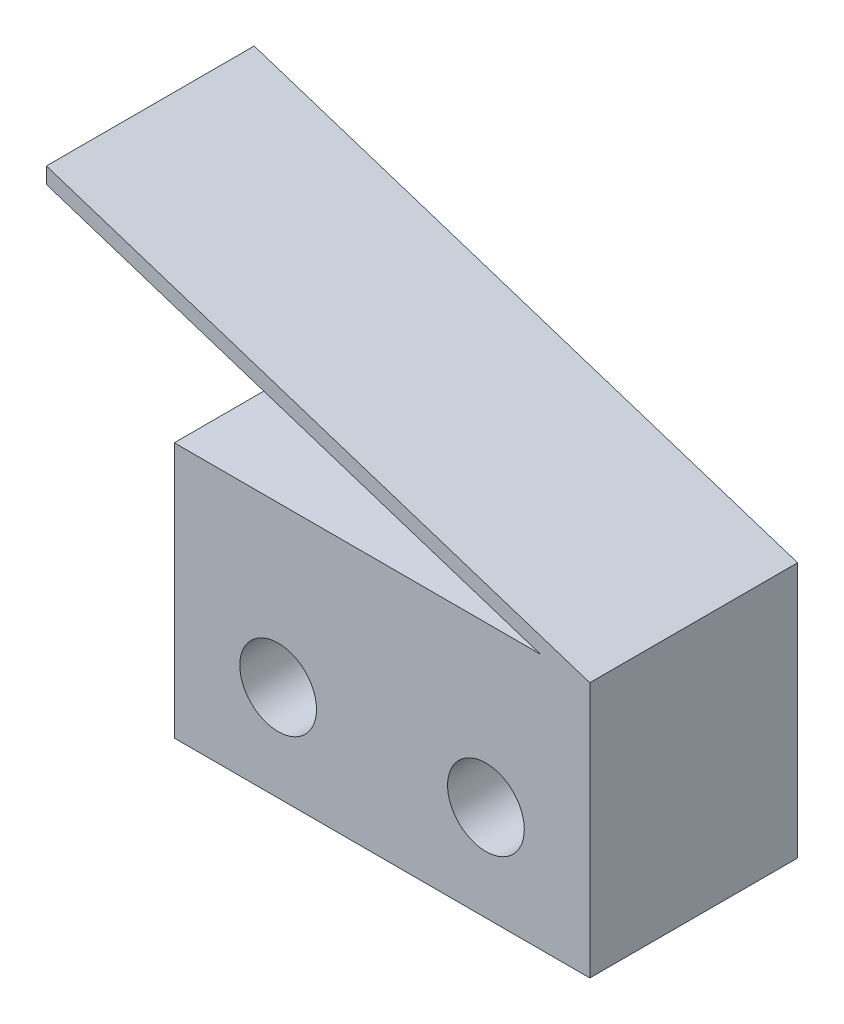
ISO-10303-21;
HEADER;
FILE_DESCRIPTION(('STEP AP214'),'2;1');
FILE_NAME('part.step','',(''),(''),'','','');
FILE_SCHEMA(('AUTOMOTIVE_DESIGN { 1 0 10303 214 1 1 1 1 }'));
ENDSEC;
DATA;
#1=APPLICATION_CONTEXT('core data for automotive mechanical design processes');
#2=APPLICATION_PROTOCOL_DEFINITION('international standard','automotive_design',2000,#1);
#3=PRODUCT_CONTEXT('',#1,'mechanical');
#4=PRODUCT('Part','Part','',(#3));
#5=PRODUCT_RELATED_PRODUCT_CATEGORY('part','',(#4));
#6=PRODUCT_DEFINITION_FORMATION('','',#4);
#7=PRODUCT_DEFINITION_CONTEXT('part definition',#1,'design');
#8=PRODUCT_DEFINITION('design','',#6,#7);
#9=PRODUCT_DEFINITION_SHAPE('','',#8);
#10=(LENGTH_UNIT() NAMED_UNIT(*) SI_UNIT(.MILLI.,.METRE.));
#11=(NAMED_UNIT(*) PLANE_ANGLE_UNIT() SI_UNIT($,.RADIAN.));
#12=(NAMED_UNIT(*) SI_UNIT($,.STERADIAN.) SOLID_ANGLE_UNIT());
#13=UNCERTAINTY_MEASURE_WITH_UNIT(LENGTH_MEASURE(1.E-05),#10,'distance_accuracy_value','');
#14=(GEOMETRIC_REPRESENTATION_CONTEXT(3) GLOBAL_UNCERTAINTY_ASSIGNED_CONTEXT((#13)) GLOBAL_UNIT_ASSIGNED_CONTEXT((#10,
#11,#12)) REPRESENTATION_CONTEXT('',''));
#15=CARTESIAN_POINT('',(0.,0.,0.));
#16=DIRECTION('',(0.,0.,1.));
#17=DIRECTION('',(1.,0.,0.));
#18=AXIS2_PLACEMENT_3D('',#15,#16,#17);
#19=CARTESIAN_POINT('',(0.,8.,6.5));
#20=DIRECTION('',(1.,0.,0.));
#21=DIRECTION('',(0.,1.,0.));
#22=AXIS2_PLACEMENT_3D('',#19,#20,#21);
#23=PLANE('',#22);
#24=DIRECTION('',(0.,-1.,0.));
#25=VECTOR('',#24,1.);
#26=CARTESIAN_POINT('',(0.,8.,0.));
#27=LINE('',#26,#25);
#28=CARTESIAN_POINT('',(0.,8.,0.));
#29=VERTEX_POINT('',#28);
#30=CARTESIAN_POINT('',(0.,0.,0.));
#31=VERTEX_POINT('',#30);
#32=EDGE_CURVE('E129',#29,#31,#27,.T.);
#33=ORIENTED_EDGE('',*,*,#32,.T.);
#34=DIRECTION('',(0.,0.,-1.));
#35=VECTOR('',#34,1.);
#36=CARTESIAN_POINT('',(0.,0.,6.5));
#37=LINE('',#36,#35);
#38=CARTESIAN_POINT('',(0.,0.,6.5));
#39=VERTEX_POINT('',#38);
#40=EDGE_CURVE('E11',#39,#31,#37,.T.);
#41=ORIENTED_EDGE('',*,*,#40,.F.);
#42=DIRECTION('',(0.,-1.,0.));
#43=VECTOR('',#42,1.);
#44=CARTESIAN_POINT('',(0.,8.,6.5));
#45=LINE('',#44,#43);
#46=CARTESIAN_POINT('',(0.,8.,6.5));
#47=VERTEX_POINT('',#46);
#48=EDGE_CURVE('E145',#47,#39,#45,.T.);
#49=ORIENTED_EDGE('',*,*,#48,.F.);
#50=DIRECTION('',(0.,0.,-1.));
#51=VECTOR('',#50,1.);
#52=CARTESIAN_POINT('',(0.,8.,6.5));
#53=LINE('',#52,#51);
#54=EDGE_CURVE('E124',#47,#29,#53,.T.);
#55=ORIENTED_EDGE('',*,*,#54,.T.);
#56=EDGE_LOOP('',(#33,#41,#49,#55));
#57=FACE_BOUND('',#56,.T.);
#58=ADVANCED_FACE('F39',(#57),#23,.F.);
#59=CARTESIAN_POINT('',(0.,0.,6.5));
#60=DIRECTION('',(0.,1.,0.));
#61=DIRECTION('',(0.,0.,1.));
#62=AXIS2_PLACEMENT_3D('',#59,#60,#61);
#63=PLANE('',#62);
#64=DIRECTION('',(1.,0.,0.));
#65=VECTOR('',#64,1.);
#66=CARTESIAN_POINT('',(0.,0.,0.));
#67=LINE('',#66,#65);
#68=CARTESIAN_POINT('',(13.,0.,0.));
#69=VERTEX_POINT('',#68);
#70=EDGE_CURVE('E135',#31,#69,#67,.T.);
#71=ORIENTED_EDGE('',*,*,#70,.T.);
#72=DIRECTION('',(0.,0.,-1.));
#73=VECTOR('',#72,1.);
#74=CARTESIAN_POINT('',(13.,0.,6.5));
#75=LINE('',#74,#73);
#76=CARTESIAN_POINT('',(13.,0.,6.5));
#77=VERTEX_POINT('',#76);
#78=EDGE_CURVE('E50',#77,#69,#75,.T.);
#79=ORIENTED_EDGE('',*,*,#78,.F.);
#80=DIRECTION('',(1.,0.,0.));
#81=VECTOR('',#80,1.);
#82=CARTESIAN_POINT('',(0.,0.,6.5));
#83=LINE('',#82,#81);
#84=EDGE_CURVE('E94',#39,#77,#83,.T.);
#85=ORIENTED_EDGE('',*,*,#84,.F.);
#86=ORIENTED_EDGE('',*,*,#40,.T.);
#87=EDGE_LOOP('',(#71,#79,#85,#86));
#88=FACE_BOUND('',#87,.T.);
#89=ADVANCED_FACE('F202',(#88),#63,.F.);
#90=CARTESIAN_POINT('',(13.,0.,6.5));
#91=DIRECTION('',(-1.,0.,0.));
#92=DIRECTION('',(0.,0.,1.));
#93=AXIS2_PLACEMENT_3D('',#90,#91,#92);
#94=PLANE('',#93);
#95=DIRECTION('',(0.,1.,0.));
#96=VECTOR('',#95,1.);
#97=CARTESIAN_POINT('',(13.,0.,0.));
#98=LINE('',#97,#96);
#99=CARTESIAN_POINT('',(13.,8.,0.));
#100=VERTEX_POINT('',#99);
#101=EDGE_CURVE('E134',#69,#100,#98,.T.);
#102=ORIENTED_EDGE('',*,*,#101,.T.);
#103=DIRECTION('',(0.,0.,-1.));
#104=VECTOR('',#103,1.);
#105=CARTESIAN_POINT('',(13.,8.,6.5));
#106=LINE('',#105,#104);
#107=CARTESIAN_POINT('',(13.,8.,6.5));
#108=VERTEX_POINT('',#107);
#109=EDGE_CURVE('E147',#108,#100,#106,.T.);
#110=ORIENTED_EDGE('',*,*,#109,.F.);
#111=DIRECTION('',(0.,1.,0.));
#112=VECTOR('',#111,1.);
#113=CARTESIAN_POINT('',(13.,0.,6.5));
#114=LINE('',#113,#112);
#115=EDGE_CURVE('E152',#77,#108,#114,.T.);
#116=ORIENTED_EDGE('',*,*,#115,.F.);
#117=ORIENTED_EDGE('',*,*,#78,.T.);
#118=EDGE_LOOP('',(#102,#110,#116,#117));
#119=FACE_BOUND('',#118,.T.);
#120=ADVANCED_FACE('F155',(#119),#94,.F.);
#121=CARTESIAN_POINT('',(13.,8.,6.5));
#122=DIRECTION('',(-0.307820285414662,-0.951444518554411,0.));
#123=DIRECTION('',(0.951444518554412,-0.307820285414663,0.));
#124=AXIS2_PLACEMENT_3D('',#121,#122,#123);
#125=PLANE('',#124);
#126=DIRECTION('',(-0.951444518554411,0.307820285414662,0.));
#127=VECTOR('',#126,1.);
#128=CARTESIAN_POINT('',(13.,8.,0.));
#129=LINE('',#128,#127);
#130=CARTESIAN_POINT('',(-4.,13.5,0.));
#131=VERTEX_POINT('',#130);
#132=EDGE_CURVE('E140',#100,#131,#129,.T.);
#133=ORIENTED_EDGE('',*,*,#132,.T.);
#134=DIRECTION('',(0.,0.,-1.));
#135=VECTOR('',#134,1.);
#136=CARTESIAN_POINT('',(-4.,13.5,6.5));
#137=LINE('',#136,#135);
#138=CARTESIAN_POINT('',(-4.,13.5,6.5));
#139=VERTEX_POINT('',#138);
#140=EDGE_CURVE('E119',#139,#131,#137,.T.);
#141=ORIENTED_EDGE('',*,*,#140,.F.);
#142=DIRECTION('',(-0.951444518554411,0.307820285414662,0.));
#143=VECTOR('',#142,1.);
#144=CARTESIAN_POINT('',(13.,8.,6.5));
#145=LINE('',#144,#143);
#146=EDGE_CURVE('E112',#108,#139,#145,.T.);
#147=ORIENTED_EDGE('',*,*,#146,.F.);
#148=ORIENTED_EDGE('',*,*,#109,.T.);
#149=EDGE_LOOP('',(#133,#141,#147,#148));
#150=FACE_BOUND('',#149,.T.);
#151=ADVANCED_FACE('F158',(#150),#125,.F.);
#152=CARTESIAN_POINT('',(-4.,13.5,6.5));
#153=DIRECTION('',(1.,0.,0.));
#154=DIRECTION('',(0.,1.,0.));
#155=AXIS2_PLACEMENT_3D('',#152,#153,#154);
#156=PLANE('',#155);
#157=DIRECTION('',(0.,-1.,0.));
#158=VECTOR('',#157,1.);
#159=CARTESIAN_POINT('',(-4.,13.5,0.));
#160=LINE('',#159,#158);
#161=CARTESIAN_POINT('',(-4.,13.,0.));
#162=VERTEX_POINT('',#161);
#163=EDGE_CURVE('E117',#131,#162,#160,.T.);
#164=ORIENTED_EDGE('',*,*,#163,.T.);
#165=DIRECTION('',(0.,0.,-1.));
#166=VECTOR('',#165,1.);
#167=CARTESIAN_POINT('',(-4.,13.,6.5));
#168=LINE('',#167,#166);
#169=CARTESIAN_POINT('',(-4.,13.,6.5));
#170=VERTEX_POINT('',#169);
#171=EDGE_CURVE('E118',#170,#162,#168,.T.);
#172=ORIENTED_EDGE('',*,*,#171,.F.);
#173=DIRECTION('',(0.,-1.,0.));
#174=VECTOR('',#173,1.);
#175=CARTESIAN_POINT('',(-4.,13.5,6.5));
#176=LINE('',#175,#174);
#177=EDGE_CURVE('E103',#139,#170,#176,.T.);
#178=ORIENTED_EDGE('',*,*,#177,.F.);
#179=ORIENTED_EDGE('',*,*,#140,.T.);
#180=EDGE_LOOP('',(#164,#172,#178,#179));
#181=FACE_BOUND('',#180,.T.);
#182=ADVANCED_FACE('F120',(#181),#156,.F.);
#183=CARTESIAN_POINT('',(-4.,13.,6.5));
#184=DIRECTION('',(0.307820285414662,0.951444518554411,0.));
#185=DIRECTION('',(-0.951444518554412,0.307820285414662,0.));
#186=AXIS2_PLACEMENT_3D('',#183,#184,#185);
#187=PLANE('',#186);
#188=DIRECTION('',(0.951444518554411,-0.307820285414662,0.));
#189=VECTOR('',#188,1.);
#190=CARTESIAN_POINT('',(-4.,13.,0.));
#191=LINE('',#190,#189);
#192=CARTESIAN_POINT('',(11.4545454545455,8.,0.));
#193=VERTEX_POINT('',#192);
#194=EDGE_CURVE('E83',#162,#193,#191,.T.);
#195=ORIENTED_EDGE('',*,*,#194,.T.);
#196=DIRECTION('',(0.,0.,-1.));
#197=VECTOR('',#196,1.);
#198=CARTESIAN_POINT('',(11.4545454545455,8.,6.5));
#199=LINE('',#198,#197);
#200=CARTESIAN_POINT('',(11.4545454545455,8.,6.5));
#201=VERTEX_POINT('',#200);
#202=EDGE_CURVE('E123',#201,#193,#199,.T.);
#203=ORIENTED_EDGE('',*,*,#202,.F.);
#204=DIRECTION('',(0.951444518554411,-0.307820285414662,0.));
#205=VECTOR('',#204,1.);
#206=CARTESIAN_POINT('',(-4.,13.,6.5));
#207=LINE('',#206,#205);
#208=EDGE_CURVE('E107',#170,#201,#207,.T.);
#209=ORIENTED_EDGE('',*,*,#208,.F.);
#210=ORIENTED_EDGE('',*,*,#171,.T.);
#211=EDGE_LOOP('',(#195,#203,#209,#210));
#212=FACE_BOUND('',#211,.T.);
#213=ADVANCED_FACE('F121',(#212),#187,.F.);
#214=CARTESIAN_POINT('',(11.4545454545455,8.,6.5));
#215=DIRECTION('',(0.,-1.,0.));
#216=DIRECTION('',(1.,0.,0.));
#217=AXIS2_PLACEMENT_3D('',#214,#215,#216);
#218=PLANE('',#217);
#219=DIRECTION('',(-1.,0.,0.));
#220=VECTOR('',#219,1.);
#221=CARTESIAN_POINT('',(11.4545454545455,8.,0.));
#222=LINE('',#221,#220);
#223=EDGE_CURVE('E90',#193,#29,#222,.T.);
#224=ORIENTED_EDGE('',*,*,#223,.T.);
#225=ORIENTED_EDGE('',*,*,#54,.F.);
#226=DIRECTION('',(-1.,0.,0.));
#227=VECTOR('',#226,1.);
#228=CARTESIAN_POINT('',(11.4545454545455,8.,6.5));
#229=LINE('',#228,#227);
#230=EDGE_CURVE('E54',#201,#47,#229,.T.);
#231=ORIENTED_EDGE('',*,*,#230,.F.);
#232=ORIENTED_EDGE('',*,*,#202,.T.);
#233=EDGE_LOOP('',(#224,#225,#231,#232));
#234=FACE_BOUND('',#233,.T.);
#235=ADVANCED_FACE('F187',(#234),#218,.F.);
#236=CARTESIAN_POINT('',(0.,0.,6.5));
#237=DIRECTION('',(0.,0.,1.));
#238=DIRECTION('',(1.,0.,0.));
#239=AXIS2_PLACEMENT_3D('',#236,#237,#238);
#240=PLANE('',#239);
#241=CARTESIAN_POINT('',(3.25,3.,6.5));
#242=DIRECTION('',(0.,0.,1.));
#243=DIRECTION('',(1.,0.,0.));
#244=AXIS2_PLACEMENT_3D('',#241,#242,#243);
#245=CIRCLE('',#244,1.2);
#246=CARTESIAN_POINT('',(4.45,3.,6.5));
#247=VERTEX_POINT('',#246);
#248=EDGE_CURVE('E173',#247,#247,#245,.T.);
#249=ORIENTED_EDGE('',*,*,#248,.F.);
#250=EDGE_LOOP('',(#249));
#251=FACE_BOUND('',#250,.T.);
#252=CARTESIAN_POINT('',(9.75,3.,6.5));
#253=DIRECTION('',(0.,0.,1.));
#254=DIRECTION('',(1.,0.,0.));
#255=AXIS2_PLACEMENT_3D('',#252,#253,#254);
#256=CIRCLE('',#255,1.2);
#257=CARTESIAN_POINT('',(10.95,3.,6.5));
#258=VERTEX_POINT('',#257);
#259=EDGE_CURVE('E164',#258,#258,#256,.T.);
#260=ORIENTED_EDGE('',*,*,#259,.F.);
#261=EDGE_LOOP('',(#260));
#262=FACE_BOUND('',#261,.T.);
#263=ORIENTED_EDGE('',*,*,#48,.T.);
#264=ORIENTED_EDGE('',*,*,#84,.T.);
#265=ORIENTED_EDGE('',*,*,#115,.T.);
#266=ORIENTED_EDGE('',*,*,#146,.T.);
#267=ORIENTED_EDGE('',*,*,#177,.T.);
#268=ORIENTED_EDGE('',*,*,#208,.T.);
#269=ORIENTED_EDGE('',*,*,#230,.T.);
#270=EDGE_LOOP('',(#263,#264,#265,#266,#267,#268,#269));
#271=FACE_BOUND('',#270,.T.);
#272=ADVANCED_FACE('F110',(#251,#262,#271),#240,.T.);
#273=CARTESIAN_POINT('',(0.,0.,0.));
#274=DIRECTION('',(0.,0.,1.));
#275=DIRECTION('',(1.,0.,0.));
#276=AXIS2_PLACEMENT_3D('',#273,#274,#275);
#277=PLANE('',#276);
#278=CARTESIAN_POINT('',(3.25,3.,0.));
#279=DIRECTION('',(0.,0.,1.));
#280=DIRECTION('',(1.,0.,0.));
#281=AXIS2_PLACEMENT_3D('',#278,#279,#280);
#282=CIRCLE('',#281,1.2);
#283=CARTESIAN_POINT('',(4.45,3.,0.));
#284=VERTEX_POINT('',#283);
#285=EDGE_CURVE('E133',#284,#284,#282,.T.);
#286=ORIENTED_EDGE('',*,*,#285,.T.);
#287=EDGE_LOOP('',(#286));
#288=FACE_BOUND('',#287,.T.);
#289=CARTESIAN_POINT('',(9.75,3.,0.));
#290=DIRECTION('',(0.,0.,1.));
#291=DIRECTION('',(1.,0.,0.));
#292=AXIS2_PLACEMENT_3D('',#289,#290,#291);
#293=CIRCLE('',#292,1.2);
#294=CARTESIAN_POINT('',(10.95,3.,0.));
#295=VERTEX_POINT('',#294);
#296=EDGE_CURVE('E166',#295,#295,#293,.T.);
#297=ORIENTED_EDGE('',*,*,#296,.T.);
#298=EDGE_LOOP('',(#297));
#299=FACE_BOUND('',#298,.T.);
#300=ORIENTED_EDGE('',*,*,#32,.F.);
#301=ORIENTED_EDGE('',*,*,#223,.F.);
#302=ORIENTED_EDGE('',*,*,#194,.F.);
#303=ORIENTED_EDGE('',*,*,#163,.F.);
#304=ORIENTED_EDGE('',*,*,#132,.F.);
#305=ORIENTED_EDGE('',*,*,#101,.F.);
#306=ORIENTED_EDGE('',*,*,#70,.F.);
#307=EDGE_LOOP('',(#300,#301,#302,#303,#304,#305,#306));
#308=FACE_BOUND('',#307,.T.);
#309=ADVANCED_FACE('F156',(#288,#299,#308),#277,.F.);
#310=CARTESIAN_POINT('',(9.75,3.,0.));
#311=DIRECTION('',(0.,0.,1.));
#312=DIRECTION('',(1.,0.,0.));
#313=AXIS2_PLACEMENT_3D('',#310,#311,#312);
#314=CYLINDRICAL_SURFACE('',#313,1.2);
#315=CARTESIAN_POINT('',(10.95,3.,0.));
#316=CARTESIAN_POINT('',(10.95,3.,0.0677083333333332));
#317=CARTESIAN_POINT('',(10.95,3.,0.135416666666667));
#318=CARTESIAN_POINT('',(10.95,3.,0.270833333333333));
#319=CARTESIAN_POINT('',(10.95,3.,0.338541666666667));
#320=CARTESIAN_POINT('',(10.95,3.,0.473958333333333));
#321=CARTESIAN_POINT('',(10.95,3.,0.541666666666667));
#322=CARTESIAN_POINT('',(10.95,3.,0.677083333333333));
#323=CARTESIAN_POINT('',(10.95,3.,0.744791666666667));
#324=CARTESIAN_POINT('',(10.95,3.,0.880208333333333));
#325=CARTESIAN_POINT('',(10.95,3.,0.947916666666667));
#326=CARTESIAN_POINT('',(10.95,3.,1.08333333333333));
#327=CARTESIAN_POINT('',(10.95,3.,1.15104166666667));
#328=CARTESIAN_POINT('',(10.95,3.,1.28645833333333));
#329=CARTESIAN_POINT('',(10.95,3.,1.35416666666667));
#330=CARTESIAN_POINT('',(10.95,3.,1.48958333333333));
#331=CARTESIAN_POINT('',(10.95,3.,1.55729166666667));
#332=CARTESIAN_POINT('',(10.95,3.,1.69270833333333));
#333=CARTESIAN_POINT('',(10.95,3.,1.76041666666667));
#334=CARTESIAN_POINT('',(10.95,3.,1.89583333333333));
#335=CARTESIAN_POINT('',(10.95,3.,1.96354166666667));
#336=CARTESIAN_POINT('',(10.95,3.,2.09895833333333));
#337=CARTESIAN_POINT('',(10.95,3.,2.16666666666667));
#338=CARTESIAN_POINT('',(10.95,3.,2.30208333333333));
#339=CARTESIAN_POINT('',(10.95,3.,2.36979166666667));
#340=CARTESIAN_POINT('',(10.95,3.,2.50520833333333));
#341=CARTESIAN_POINT('',(10.95,3.,2.57291666666667));
#342=CARTESIAN_POINT('',(10.95,3.,2.70833333333333));
#343=CARTESIAN_POINT('',(10.95,3.,2.77604166666667));
#344=CARTESIAN_POINT('',(10.95,3.,2.91145833333333));
#345=CARTESIAN_POINT('',(10.95,3.,2.97916666666667));
#346=CARTESIAN_POINT('',(10.95,3.,3.11458333333333));
#347=CARTESIAN_POINT('',(10.95,3.,3.18229166666667));
#348=CARTESIAN_POINT('',(10.95,3.,3.31770833333333));
#349=CARTESIAN_POINT('',(10.95,3.,3.38541666666667));
#350=CARTESIAN_POINT('',(10.95,3.,3.52083333333333));
#351=CARTESIAN_POINT('',(10.95,3.,3.58854166666667));
#352=CARTESIAN_POINT('',(10.95,3.,3.72395833333333));
#353=CARTESIAN_POINT('',(10.95,3.,3.79166666666667));
#354=CARTESIAN_POINT('',(10.95,3.,3.92708333333333));
#355=CARTESIAN_POINT('',(10.95,3.,3.99479166666667));
#356=CARTESIAN_POINT('',(10.95,3.,4.13020833333333));
#357=CARTESIAN_POINT('',(10.95,3.,4.19791666666667));
#358=CARTESIAN_POINT('',(10.95,3.,4.33333333333333));
#359=CARTESIAN_POINT('',(10.95,3.,4.40104166666667));
#360=CARTESIAN_POINT('',(10.95,3.,4.53645833333333));
#361=CARTESIAN_POINT('',(10.95,3.,4.60416666666667));
#362=CARTESIAN_POINT('',(10.95,3.,4.73958333333333));
#363=CARTESIAN_POINT('',(10.95,3.,4.80729166666667));
#364=CARTESIAN_POINT('',(10.95,3.,4.94270833333333));
#365=CARTESIAN_POINT('',(10.95,3.,5.01041666666667));
#366=CARTESIAN_POINT('',(10.95,3.,5.14583333333333));
#367=CARTESIAN_POINT('',(10.95,3.,5.21354166666667));
#368=CARTESIAN_POINT('',(10.95,3.,5.34895833333333));
#369=CARTESIAN_POINT('',(10.95,3.,5.41666666666667));
#370=CARTESIAN_POINT('',(10.95,3.,5.55208333333333));
#371=CARTESIAN_POINT('',(10.95,3.,5.61979166666667));
#372=CARTESIAN_POINT('',(10.95,3.,5.75520833333333));
#373=CARTESIAN_POINT('',(10.95,3.,5.82291666666667));
#374=CARTESIAN_POINT('',(10.95,3.,5.95833333333333));
#375=CARTESIAN_POINT('',(10.95,3.,6.02604166666667));
#376=CARTESIAN_POINT('',(10.95,3.,6.16145833333333));
#377=CARTESIAN_POINT('',(10.95,3.,6.22916666666667));
#378=CARTESIAN_POINT('',(10.95,3.,6.36458333333333));
#379=CARTESIAN_POINT('',(10.95,3.,6.43229166666667));
#380=CARTESIAN_POINT('',(10.95,3.,6.5));
#381=B_SPLINE_CURVE_WITH_KNOTS('',3,(#315,#316,#317,#318,#319,#320,#321,#322,#323,#324,#325,
#326,#327,#328,#329,#330,#331,#332,#333,#334,#335,#336,#337,#338,#339,#340,#341,#342,#343,#344,
#345,#346,#347,#348,#349,#350,#351,#352,#353,#354,#355,#356,#357,#358,#359,#360,#361,#362,#363,
#364,#365,#366,#367,#368,#369,#370,#371,#372,#373,#374,#375,#376,#377,#378,#379,#380),
.UNSPECIFIED.,.F.,.F.,(4,2,2,2,2,2,2,2,2,2,2,2,2,2,2,2,2,2,2,2,2,2,2,2,2,2,2,2,2,2,2,2,4),(0.,
0.203125,0.40625,0.609375,0.8125,1.015625,1.21875,1.421875,1.625,1.828125,2.03125,2.234375,
2.4375,2.640625,2.84375,3.046875,3.25,3.453125,3.65625,3.859375,4.0625,4.265625,4.46875,
4.671875,4.875,5.078125,5.28125,5.484375,5.6875,5.890625,6.09375,6.296875,6.5),.UNSPECIFIED.);
#382=EDGE_CURVE('BSEAM185',#295,#258,#381,.T.);
#383=ORIENTED_EDGE('',*,*,#296,.F.);
#384=ORIENTED_EDGE('',*,*,#259,.T.);
#385=ORIENTED_EDGE('',*,*,#382,.T.);
#386=ORIENTED_EDGE('',*,*,#382,.F.);
#387=EDGE_LOOP('',(#383,#385,#384,#386));
#388=FACE_BOUND('',#387,.T.);
#389=ADVANCED_FACE('F185',(#388),#314,.F.);
#390=CARTESIAN_POINT('',(3.25,3.,0.));
#391=DIRECTION('',(0.,0.,1.));
#392=DIRECTION('',(1.,0.,0.));
#393=AXIS2_PLACEMENT_3D('',#390,#391,#392);
#394=CYLINDRICAL_SURFACE('',#393,1.2);
#395=CARTESIAN_POINT('',(4.45,3.,0.));
#396=CARTESIAN_POINT('',(4.45,3.,0.0677083333333332));
#397=CARTESIAN_POINT('',(4.45,3.,0.135416666666667));
#398=CARTESIAN_POINT('',(4.45,3.,0.270833333333333));
#399=CARTESIAN_POINT('',(4.45,3.,0.338541666666667));
#400=CARTESIAN_POINT('',(4.45,3.,0.473958333333333));
#401=CARTESIAN_POINT('',(4.45,3.,0.541666666666667));
#402=CARTESIAN_POINT('',(4.45,3.,0.677083333333333));
#403=CARTESIAN_POINT('',(4.45,3.,0.744791666666667));
#404=CARTESIAN_POINT('',(4.45,3.,0.880208333333333));
#405=CARTESIAN_POINT('',(4.45,3.,0.947916666666667));
#406=CARTESIAN_POINT('',(4.45,3.,1.08333333333333));
#407=CARTESIAN_POINT('',(4.45,3.,1.15104166666667));
#408=CARTESIAN_POINT('',(4.45,3.,1.28645833333333));
#409=CARTESIAN_POINT('',(4.45,3.,1.35416666666667));
#410=CARTESIAN_POINT('',(4.45,3.,1.48958333333333));
#411=CARTESIAN_POINT('',(4.45,3.,1.55729166666667));
#412=CARTESIAN_POINT('',(4.45,3.,1.69270833333333));
#413=CARTESIAN_POINT('',(4.45,3.,1.76041666666667));
#414=CARTESIAN_POINT('',(4.45,3.,1.89583333333333));
#415=CARTESIAN_POINT('',(4.45,3.,1.96354166666667));
#416=CARTESIAN_POINT('',(4.45,3.,2.09895833333333));
#417=CARTESIAN_POINT('',(4.45,3.,2.16666666666667));
#418=CARTESIAN_POINT('',(4.45,3.,2.30208333333333));
#419=CARTESIAN_POINT('',(4.45,3.,2.36979166666667));
#420=CARTESIAN_POINT('',(4.45,3.,2.50520833333333));
#421=CARTESIAN_POINT('',(4.45,3.,2.57291666666667));
#422=CARTESIAN_POINT('',(4.45,3.,2.70833333333333));
#423=CARTESIAN_POINT('',(4.45,3.,2.77604166666667));
#424=CARTESIAN_POINT('',(4.45,3.,2.91145833333333));
#425=CARTESIAN_POINT('',(4.45,3.,2.97916666666667));
#426=CARTESIAN_POINT('',(4.45,3.,3.11458333333333));
#427=CARTESIAN_POINT('',(4.45,3.,3.18229166666667));
#428=CARTESIAN_POINT('',(4.45,3.,3.31770833333333));
#429=CARTESIAN_POINT('',(4.45,3.,3.38541666666667));
#430=CARTESIAN_POINT('',(4.45,3.,3.52083333333333));
#431=CARTESIAN_POINT('',(4.45,3.,3.58854166666667));
#432=CARTESIAN_POINT('',(4.45,3.,3.72395833333333));
#433=CARTESIAN_POINT('',(4.45,3.,3.79166666666667));
#434=CARTESIAN_POINT('',(4.45,3.,3.92708333333333));
#435=CARTESIAN_POINT('',(4.45,3.,3.99479166666667));
#436=CARTESIAN_POINT('',(4.45,3.,4.13020833333333));
#437=CARTESIAN_POINT('',(4.45,3.,4.19791666666667));
#438=CARTESIAN_POINT('',(4.45,3.,4.33333333333333));
#439=CARTESIAN_POINT('',(4.45,3.,4.40104166666667));
#440=CARTESIAN_POINT('',(4.45,3.,4.53645833333333));
#441=CARTESIAN_POINT('',(4.45,3.,4.60416666666667));
#442=CARTESIAN_POINT('',(4.45,3.,4.73958333333333));
#443=CARTESIAN_POINT('',(4.45,3.,4.80729166666667));
#444=CARTESIAN_POINT('',(4.45,3.,4.94270833333333));
#445=CARTESIAN_POINT('',(4.45,3.,5.01041666666667));
#446=CARTESIAN_POINT('',(4.45,3.,5.14583333333333));
#447=CARTESIAN_POINT('',(4.45,3.,5.21354166666667));
#448=CARTESIAN_POINT('',(4.45,3.,5.34895833333333));
#449=CARTESIAN_POINT('',(4.45,3.,5.41666666666667));
#450=CARTESIAN_POINT('',(4.45,3.,5.55208333333333));
#451=CARTESIAN_POINT('',(4.45,3.,5.61979166666667));
#452=CARTESIAN_POINT('',(4.45,3.,5.75520833333333));
#453=CARTESIAN_POINT('',(4.45,3.,5.82291666666667));
#454=CARTESIAN_POINT('',(4.45,3.,5.95833333333333));
#455=CARTESIAN_POINT('',(4.45,3.,6.02604166666667));
#456=CARTESIAN_POINT('',(4.45,3.,6.16145833333333));
#457=CARTESIAN_POINT('',(4.45,3.,6.22916666666667));
#458=CARTESIAN_POINT('',(4.45,3.,6.36458333333333));
#459=CARTESIAN_POINT('',(4.45,3.,6.43229166666667));
#460=CARTESIAN_POINT('',(4.45,3.,6.5));
#461=B_SPLINE_CURVE_WITH_KNOTS('',3,(#395,#396,#397,#398,#399,#400,#401,#402,#403,#404,#405,
#406,#407,#408,#409,#410,#411,#412,#413,#414,#415,#416,#417,#418,#419,#420,#421,#422,#423,#424,
#425,#426,#427,#428,#429,#430,#431,#432,#433,#434,#435,#436,#437,#438,#439,#440,#441,#442,#443,
#444,#445,#446,#447,#448,#449,#450,#451,#452,#453,#454,#455,#456,#457,#458,#459,#460),
.UNSPECIFIED.,.F.,.F.,(4,2,2,2,2,2,2,2,2,2,2,2,2,2,2,2,2,2,2,2,2,2,2,2,2,2,2,2,2,2,2,2,4),(0.,
0.203125,0.40625,0.609375,0.8125,1.015625,1.21875,1.421875,1.625,1.828125,2.03125,2.234375,
2.4375,2.640625,2.84375,3.046875,3.25,3.453125,3.65625,3.859375,4.0625,4.265625,4.46875,
4.671875,4.875,5.078125,5.28125,5.484375,5.6875,5.890625,6.09375,6.296875,6.5),.UNSPECIFIED.);
#462=EDGE_CURVE('BSEAM177',#284,#247,#461,.T.);
#463=ORIENTED_EDGE('',*,*,#285,.F.);
#464=ORIENTED_EDGE('',*,*,#248,.T.);
#465=ORIENTED_EDGE('',*,*,#462,.T.);
#466=ORIENTED_EDGE('',*,*,#462,.F.);
#467=EDGE_LOOP('',(#463,#465,#464,#466));
#468=FACE_BOUND('',#467,.T.);
#469=ADVANCED_FACE('F177',(#468),#394,.F.);
#470=CLOSED_SHELL('',(#58,#89,#120,#151,#182,#213,#235,#272,#309,#389,#469));
#471=MANIFOLD_SOLID_BREP('B2',#470);
#472=ADVANCED_BREP_SHAPE_REPRESENTATION('',(#18,#471),#14);
#473=SHAPE_DEFINITION_REPRESENTATION(#9,#472);
ENDSEC;
END-ISO-10303-21;
